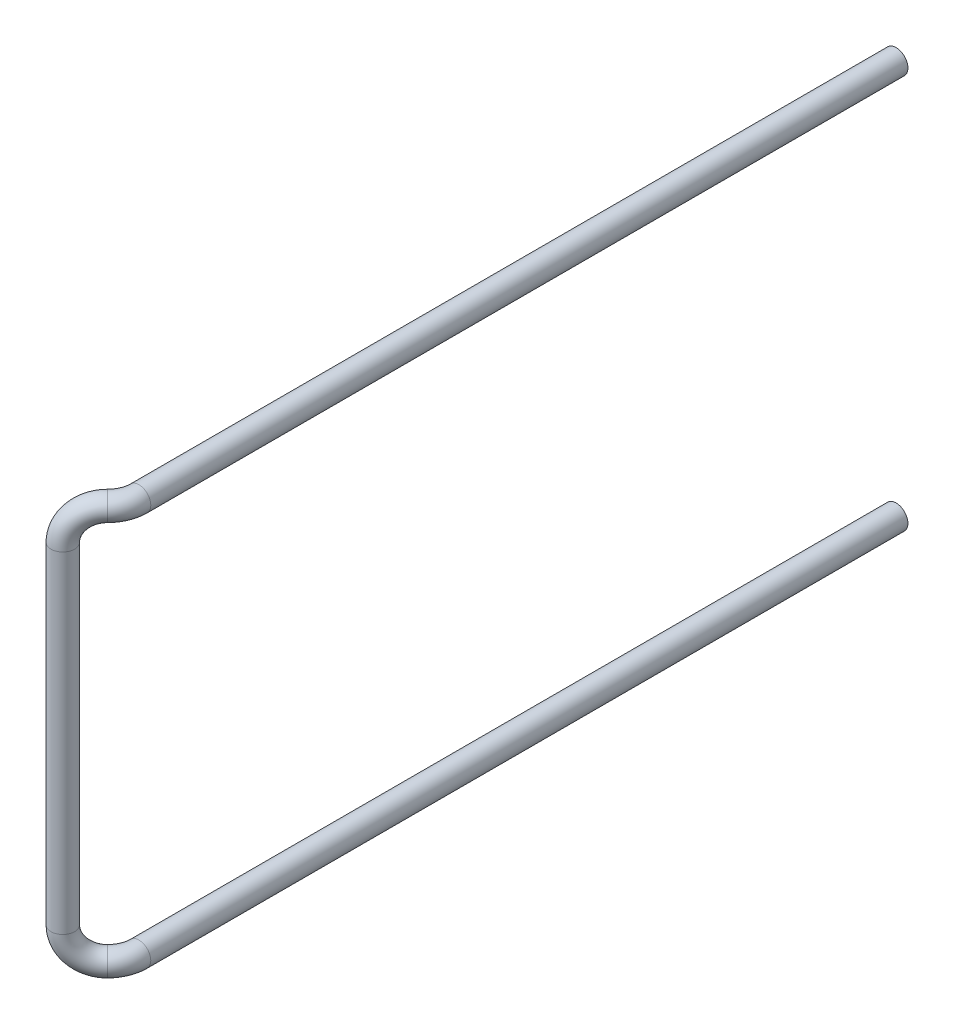
ISO-10303-21;
HEADER;
FILE_DESCRIPTION(('STEP AP214'),'2;1');
FILE_NAME('part.step','',(''),(''),'','','');
FILE_SCHEMA(('AUTOMOTIVE_DESIGN { 1 0 10303 214 1 1 1 1 }'));
ENDSEC;
DATA;
#1=APPLICATION_CONTEXT('core data for automotive mechanical design processes');
#2=APPLICATION_PROTOCOL_DEFINITION('international standard','automotive_design',2000,#1);
#3=PRODUCT_CONTEXT('',#1,'mechanical');
#4=PRODUCT('Part','Part','',(#3));
#5=PRODUCT_RELATED_PRODUCT_CATEGORY('part','',(#4));
#6=PRODUCT_DEFINITION_FORMATION('','',#4);
#7=PRODUCT_DEFINITION_CONTEXT('part definition',#1,'design');
#8=PRODUCT_DEFINITION('design','',#6,#7);
#9=PRODUCT_DEFINITION_SHAPE('','',#8);
#10=(LENGTH_UNIT() NAMED_UNIT(*) SI_UNIT(.MILLI.,.METRE.));
#11=(NAMED_UNIT(*) PLANE_ANGLE_UNIT() SI_UNIT($,.RADIAN.));
#12=(NAMED_UNIT(*) SI_UNIT($,.STERADIAN.) SOLID_ANGLE_UNIT());
#13=UNCERTAINTY_MEASURE_WITH_UNIT(LENGTH_MEASURE(1.E-05),#10,'distance_accuracy_value','');
#14=(GEOMETRIC_REPRESENTATION_CONTEXT(3) GLOBAL_UNCERTAINTY_ASSIGNED_CONTEXT((#13)) GLOBAL_UNIT_ASSIGNED_CONTEXT((#10,
#11,#12)) REPRESENTATION_CONTEXT('',''));
#15=CARTESIAN_POINT('',(0.,0.,0.));
#16=DIRECTION('',(0.,0.,1.));
#17=DIRECTION('',(1.,0.,0.));
#18=AXIS2_PLACEMENT_3D('',#15,#16,#17);
#19=CARTESIAN_POINT('',(0.,0.,304.8));
#20=DIRECTION('',(0.,0.,-1.));
#21=DIRECTION('',(-1.,0.,0.));
#22=AXIS2_PLACEMENT_3D('',#19,#20,#21);
#23=CYLINDRICAL_SURFACE('',#22,4.7625);
#24=CARTESIAN_POINT('',(0.,0.,304.8));
#25=DIRECTION('',(0.,0.,1.));
#26=DIRECTION('',(1.,0.,0.));
#27=AXIS2_PLACEMENT_3D('',#24,#25,#26);
#28=CIRCLE('',#27,4.7625);
#29=CARTESIAN_POINT('',(4.7625,0.,304.8));
#30=VERTEX_POINT('',#29);
#31=EDGE_CURVE('E11',#30,#30,#28,.T.);
#32=ORIENTED_EDGE('',*,*,#31,.F.);
#33=EDGE_LOOP('',(#32));
#34=FACE_BOUND('',#33,.T.);
#35=CARTESIAN_POINT('',(0.,0.,0.));
#36=DIRECTION('',(0.,0.,1.));
#37=DIRECTION('',(1.,0.,0.));
#38=AXIS2_PLACEMENT_3D('',#35,#36,#37);
#39=CIRCLE('',#38,4.7625);
#40=CARTESIAN_POINT('',(4.7625,0.,0.));
#41=VERTEX_POINT('',#40);
#42=EDGE_CURVE('E49',#41,#41,#39,.T.);
#43=ORIENTED_EDGE('',*,*,#42,.T.);
#44=EDGE_LOOP('',(#43));
#45=FACE_BOUND('',#44,.T.);
#46=ADVANCED_FACE('F50',(#34,#45),#23,.T.);
#47=CARTESIAN_POINT('',(0.,0.,0.));
#48=DIRECTION('',(0.,0.,1.));
#49=DIRECTION('',(1.,0.,0.));
#50=AXIS2_PLACEMENT_3D('',#47,#48,#49);
#51=PLANE('',#50);
#52=ORIENTED_EDGE('',*,*,#42,.F.);
#53=EDGE_LOOP('',(#52));
#54=FACE_BOUND('',#53,.T.);
#55=ADVANCED_FACE('F98',(#54),#51,.F.);
#56=CARTESIAN_POINT('',(-12.7,0.,304.8));
#57=DIRECTION('',(0.,-1.,0.));
#58=DIRECTION('',(0.,0.,-1.));
#59=AXIS2_PLACEMENT_3D('',#56,#57,#58);
#60=TOROIDAL_SURFACE('',#59,12.7,4.7625);
#61=CARTESIAN_POINT('',(-3.71974387893087,0.,313.780256121069));
#62=DIRECTION('',(-0.707106781186549,0.,0.707106781186546));
#63=DIRECTION('',(0.707106781186546,0.,0.707106781186549));
#64=AXIS2_PLACEMENT_3D('',#61,#62,#63);
#65=CIRCLE('',#64,4.7625);
#66=CARTESIAN_POINT('',(-0.352147833529944,0.,317.14785216647));
#67=VERTEX_POINT('',#66);
#68=EDGE_CURVE('E60',#67,#67,#65,.T.);
#69=CARTESIAN_POINT('',(-12.7,0.,304.8));
#70=DIRECTION('',(0.,-1.,0.));
#71=DIRECTION('',(0.,0.,-1.));
#72=AXIS2_PLACEMENT_3D('',#69,#70,#71);
#73=CIRCLE('',#72,17.4625);
#74=EDGE_CURVE('',#30,#67,#73,.T.);
#75=ORIENTED_EDGE('',*,*,#31,.T.);
#76=ORIENTED_EDGE('',*,*,#68,.F.);
#77=ORIENTED_EDGE('',*,*,#74,.T.);
#78=ORIENTED_EDGE('',*,*,#74,.F.);
#79=EDGE_LOOP('',(#75,#77,#76,#78));
#80=FACE_BOUND('',#79,.T.);
#81=ADVANCED_FACE('F94',(#80),#60,.T.);
#82=CARTESIAN_POINT('',(-3.71974387893093,-12.7,313.780256121069));
#83=DIRECTION('',(0.707106781186546,0.,0.707106781186549));
#84=DIRECTION('',(0.707106781186549,0.,-0.707106781186546));
#85=AXIS2_PLACEMENT_3D('',#82,#83,#84);
#86=TOROIDAL_SURFACE('',#85,12.7,4.76249999999998);
#87=CARTESIAN_POINT('',(-12.7,-12.7,322.760512242138));
#88=DIRECTION('',(0.,-1.,0.));
#89=DIRECTION('',(0.707106781186546,0.,0.707106781186549));
#90=AXIS2_PLACEMENT_3D('',#87,#88,#89);
#91=CIRCLE('',#90,4.76249999999998);
#92=CARTESIAN_POINT('',(-9.33240395459913,-12.7,326.128108287539));
#93=VERTEX_POINT('',#92);
#94=EDGE_CURVE('E63',#93,#93,#91,.T.);
#95=ORIENTED_EDGE('',*,*,#94,.F.);
#96=EDGE_LOOP('',(#95));
#97=FACE_BOUND('',#96,.T.);
#98=ORIENTED_EDGE('',*,*,#68,.T.);
#99=EDGE_LOOP('',(#98));
#100=FACE_BOUND('',#99,.T.);
#101=ADVANCED_FACE('F81',(#97,#100),#86,.T.);
#102=CARTESIAN_POINT('',(-12.6999999999999,-79.375,322.760512242138));
#103=DIRECTION('',(0.,1.,0.));
#104=DIRECTION('',(0.,0.,1.));
#105=AXIS2_PLACEMENT_3D('',#102,#103,#104);
#106=CYLINDRICAL_SURFACE('',#105,4.76249999999999);
#107=ORIENTED_EDGE('',*,*,#94,.T.);
#108=EDGE_LOOP('',(#107));
#109=FACE_BOUND('',#108,.T.);
#110=CARTESIAN_POINT('',(-12.6999999999998,-146.05,322.760512242138));
#111=DIRECTION('',(0.,-1.,0.));
#112=DIRECTION('',(0.707106781186546,0.,0.707106781186549));
#113=AXIS2_PLACEMENT_3D('',#110,#111,#112);
#114=CIRCLE('',#113,4.76249999999998);
#115=CARTESIAN_POINT('',(-9.33240395459884,-146.05,326.128108287539));
#116=VERTEX_POINT('',#115);
#117=EDGE_CURVE('E71',#116,#116,#114,.T.);
#118=ORIENTED_EDGE('',*,*,#117,.F.);
#119=EDGE_LOOP('',(#118));
#120=FACE_BOUND('',#119,.T.);
#121=ADVANCED_FACE('F76',(#109,#120),#106,.T.);
#122=CARTESIAN_POINT('',(3.43683415060525E-13,-158.75,304.8));
#123=DIRECTION('',(0.,0.,-1.));
#124=DIRECTION('',(-1.,0.,0.));
#125=AXIS2_PLACEMENT_3D('',#122,#123,#124);
#126=CYLINDRICAL_SURFACE('',#125,4.7625);
#127=CARTESIAN_POINT('',(3.43683415060525E-13,-158.75,304.8));
#128=DIRECTION('',(0.,0.,-1.));
#129=DIRECTION('',(1.,0.,0.));
#130=AXIS2_PLACEMENT_3D('',#127,#128,#129);
#131=CIRCLE('',#130,4.7625);
#132=CARTESIAN_POINT('',(4.76250000000034,-158.75,304.8));
#133=VERTEX_POINT('',#132);
#134=EDGE_CURVE('E65',#133,#133,#131,.T.);
#135=ORIENTED_EDGE('',*,*,#134,.T.);
#136=EDGE_LOOP('',(#135));
#137=FACE_BOUND('',#136,.T.);
#138=CARTESIAN_POINT('',(3.43683415060522E-13,-158.749999999998,-3.61308205576446E-13));
#139=DIRECTION('',(0.,0.,-1.));
#140=DIRECTION('',(1.,0.,0.));
#141=AXIS2_PLACEMENT_3D('',#138,#139,#140);
#142=CIRCLE('',#141,4.7625);
#143=CARTESIAN_POINT('',(4.76250000000034,-158.749999999998,-3.61308205576446E-13));
#144=VERTEX_POINT('',#143);
#145=EDGE_CURVE('E61',#144,#144,#142,.T.);
#146=ORIENTED_EDGE('',*,*,#145,.F.);
#147=EDGE_LOOP('',(#146));
#148=FACE_BOUND('',#147,.T.);
#149=ADVANCED_FACE('F85',(#137,#148),#126,.T.);
#150=CARTESIAN_POINT('',(3.43683415060522E-13,-158.749999999998,-3.61308205576446E-13));
#151=DIRECTION('',(0.,0.,1.));
#152=DIRECTION('',(1.,0.,0.));
#153=AXIS2_PLACEMENT_3D('',#150,#151,#152);
#154=PLANE('',#153);
#155=ORIENTED_EDGE('',*,*,#145,.T.);
#156=EDGE_LOOP('',(#155));
#157=FACE_BOUND('',#156,.T.);
#158=ADVANCED_FACE('F89',(#157),#154,.F.);
#159=CARTESIAN_POINT('',(-12.6999999999997,-158.75,304.8));
#160=DIRECTION('',(0.,1.,0.));
#161=DIRECTION('',(0.,0.,-1.));
#162=AXIS2_PLACEMENT_3D('',#159,#160,#161);
#163=TOROIDAL_SURFACE('',#162,12.7,4.7625);
#164=CARTESIAN_POINT('',(-3.71974387893053,-158.75,313.780256121069));
#165=DIRECTION('',(0.707106781186549,0.,-0.707106781186546));
#166=DIRECTION('',(0.707106781186546,0.,0.707106781186549));
#167=AXIS2_PLACEMENT_3D('',#164,#165,#166);
#168=CIRCLE('',#167,4.7625);
#169=CARTESIAN_POINT('',(-0.3521478335296,-158.75,317.14785216647));
#170=VERTEX_POINT('',#169);
#171=EDGE_CURVE('E66',#170,#170,#168,.T.);
#172=CARTESIAN_POINT('',(-12.6999999999997,-158.75,304.8));
#173=DIRECTION('',(0.,1.,0.));
#174=DIRECTION('',(0.,0.,-1.));
#175=AXIS2_PLACEMENT_3D('',#172,#173,#174);
#176=CIRCLE('',#175,17.4625);
#177=EDGE_CURVE('',#170,#133,#176,.T.);
#178=ORIENTED_EDGE('',*,*,#171,.T.);
#179=ORIENTED_EDGE('',*,*,#134,.F.);
#180=ORIENTED_EDGE('',*,*,#177,.T.);
#181=ORIENTED_EDGE('',*,*,#177,.F.);
#182=EDGE_LOOP('',(#178,#180,#179,#181));
#183=FACE_BOUND('',#182,.T.);
#184=ADVANCED_FACE('F145',(#183),#163,.T.);
#185=CARTESIAN_POINT('',(-3.71974387893064,-146.05,313.780256121069));
#186=DIRECTION('',(0.707106781186546,0.,0.707106781186549));
#187=DIRECTION('',(0.707106781186549,0.,-0.707106781186546));
#188=AXIS2_PLACEMENT_3D('',#185,#186,#187);
#189=TOROIDAL_SURFACE('',#188,12.7,4.76249999999998);
#190=ORIENTED_EDGE('',*,*,#117,.T.);
#191=EDGE_LOOP('',(#190));
#192=FACE_BOUND('',#191,.T.);
#193=ORIENTED_EDGE('',*,*,#171,.F.);
#194=EDGE_LOOP('',(#193));
#195=FACE_BOUND('',#194,.T.);
#196=ADVANCED_FACE('F79',(#192,#195),#189,.T.);
#197=CLOSED_SHELL('',(#46,#55,#81,#101,#121,#149,#158,#184,#196));
#198=MANIFOLD_SOLID_BREP('B2',#197);
#199=ADVANCED_BREP_SHAPE_REPRESENTATION('',(#18,#198),#14);
#200=SHAPE_DEFINITION_REPRESENTATION(#9,#199);
ENDSEC;
END-ISO-10303-21;
